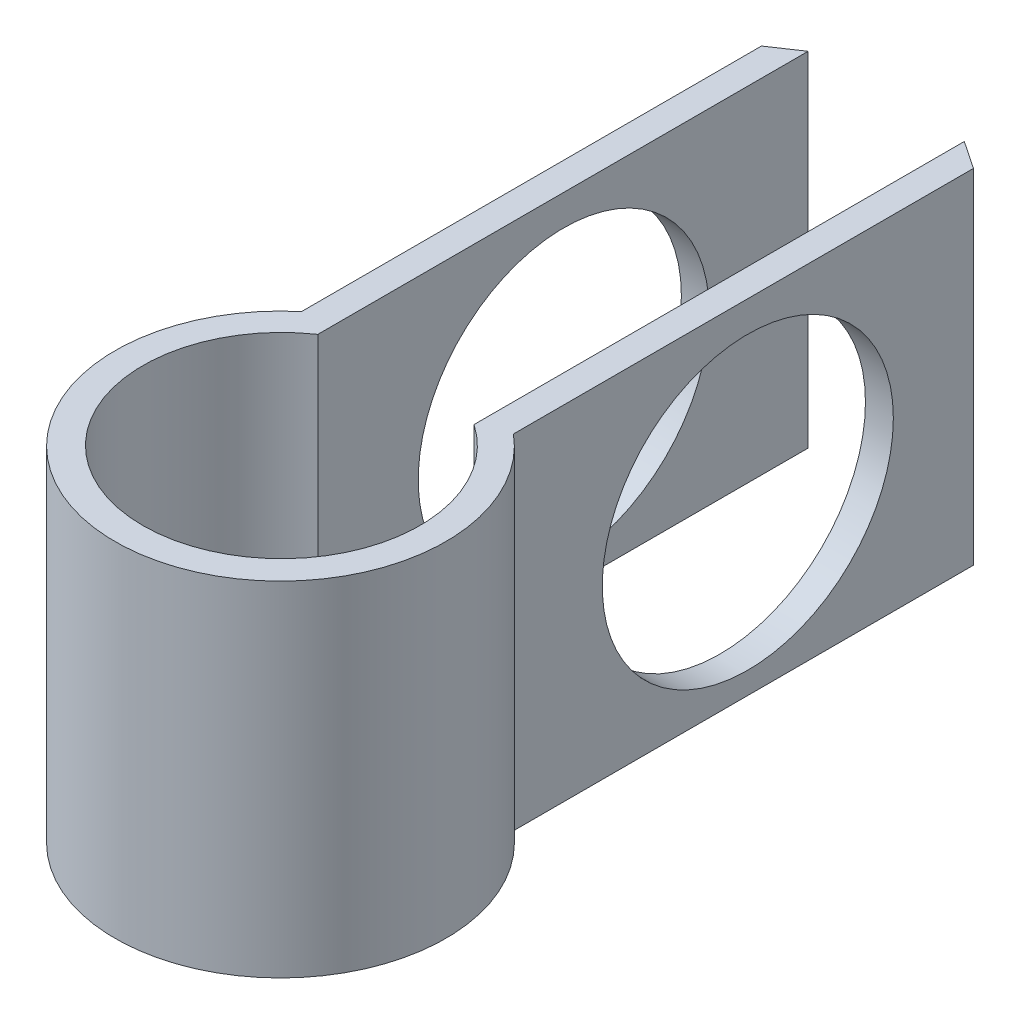
ISO-10303-21;
HEADER;
FILE_DESCRIPTION(('STEP AP214'),'2;1');
FILE_NAME('part.step','',(''),(''),'','','');
FILE_SCHEMA(('AUTOMOTIVE_DESIGN { 1 0 10303 214 1 1 1 1 }'));
ENDSEC;
DATA;
#1=APPLICATION_CONTEXT('core data for automotive mechanical design processes');
#2=APPLICATION_PROTOCOL_DEFINITION('international standard','automotive_design',2000,#1);
#3=PRODUCT_CONTEXT('',#1,'mechanical');
#4=PRODUCT('Part','Part','',(#3));
#5=PRODUCT_RELATED_PRODUCT_CATEGORY('part','',(#4));
#6=PRODUCT_DEFINITION_FORMATION('','',#4);
#7=PRODUCT_DEFINITION_CONTEXT('part definition',#1,'design');
#8=PRODUCT_DEFINITION('design','',#6,#7);
#9=PRODUCT_DEFINITION_SHAPE('','',#8);
#10=(LENGTH_UNIT() NAMED_UNIT(*) SI_UNIT(.MILLI.,.METRE.));
#11=(NAMED_UNIT(*) PLANE_ANGLE_UNIT() SI_UNIT($,.RADIAN.));
#12=(NAMED_UNIT(*) SI_UNIT($,.STERADIAN.) SOLID_ANGLE_UNIT());
#13=UNCERTAINTY_MEASURE_WITH_UNIT(LENGTH_MEASURE(1.E-05),#10,'distance_accuracy_value','');
#14=(GEOMETRIC_REPRESENTATION_CONTEXT(3) GLOBAL_UNCERTAINTY_ASSIGNED_CONTEXT((#13)) GLOBAL_UNIT_ASSIGNED_CONTEXT((#10,
#11,#12)) REPRESENTATION_CONTEXT('',''));
#15=CARTESIAN_POINT('',(0.,0.,0.));
#16=DIRECTION('',(0.,0.,1.));
#17=DIRECTION('',(1.,0.,0.));
#18=AXIS2_PLACEMENT_3D('',#15,#16,#17);
#19=CARTESIAN_POINT('',(136.250172,-31.57982,-107.259882));
#20=DIRECTION('',(0.557262321582365,0.,-0.830336501031138));
#21=DIRECTION('',(-0.830336501031138,0.,-0.557262321582365));
#22=AXIS2_PLACEMENT_3D('',#19,#20,#21);
#23=PLANE('',#22);
#24=DIRECTION('',(-0.830336501031138,0.,-0.557262321582365));
#25=VECTOR('',#24,1.);
#26=CARTESIAN_POINT('',(136.250172,0.,-107.259882));
#27=LINE('',#26,#25);
#28=CARTESIAN_POINT('',(136.250172,0.,-107.259882));
#29=VERTEX_POINT('',#28);
#30=CARTESIAN_POINT('',(133.688328,0.,-108.979208));
#31=VERTEX_POINT('',#30);
#32=EDGE_CURVE('E131',#29,#31,#27,.T.);
#33=ORIENTED_EDGE('',*,*,#32,.F.);
#34=DIRECTION('',(0.,1.,0.));
#35=VECTOR('',#34,1.);
#36=CARTESIAN_POINT('',(136.250172,-31.57982,-107.259882));
#37=LINE('',#36,#35);
#38=CARTESIAN_POINT('',(136.250172,-31.57982,-107.259882));
#39=VERTEX_POINT('',#38);
#40=EDGE_CURVE('E11',#39,#29,#37,.T.);
#41=ORIENTED_EDGE('',*,*,#40,.F.);
#42=DIRECTION('',(-0.830336501031138,0.,-0.557262321582365));
#43=VECTOR('',#42,1.);
#44=CARTESIAN_POINT('',(136.250172,-31.57982,-107.259882));
#45=LINE('',#44,#43);
#46=CARTESIAN_POINT('',(133.688328,-31.57982,-108.979208));
#47=VERTEX_POINT('',#46);
#48=EDGE_CURVE('E152',#39,#47,#45,.T.);
#49=ORIENTED_EDGE('',*,*,#48,.T.);
#50=DIRECTION('',(0.,1.,0.));
#51=VECTOR('',#50,1.);
#52=CARTESIAN_POINT('',(133.688328,-31.57982,-108.979208));
#53=LINE('',#52,#51);
#54=EDGE_CURVE('E89',#47,#31,#53,.T.);
#55=ORIENTED_EDGE('',*,*,#54,.T.);
#56=EDGE_LOOP('',(#33,#41,#49,#55));
#57=FACE_BOUND('',#56,.T.);
#58=ADVANCED_FACE('F33',(#57),#23,.T.);
#59=CARTESIAN_POINT('',(136.250172,-31.57982,-107.259882));
#60=DIRECTION('',(1.,0.,0.));
#61=DIRECTION('',(0.,0.,-1.));
#62=AXIS2_PLACEMENT_3D('',#59,#60,#61);
#63=PLANE('',#62);
#64=CARTESIAN_POINT('',(136.250172,-16.195802,-86.524338));
#65=DIRECTION('',(1.,0.,0.));
#66=DIRECTION('',(0.,0.,-1.));
#67=AXIS2_PLACEMENT_3D('',#64,#65,#66);
#68=CIRCLE('',#67,13.3728018566386);
#69=CARTESIAN_POINT('',(136.250172,-16.195802,-99.8971398566386));
#70=VERTEX_POINT('',#69);
#71=EDGE_CURVE('E201',#70,#70,#68,.T.);
#72=ORIENTED_EDGE('',*,*,#71,.F.);
#73=EDGE_LOOP('',(#72));
#74=FACE_BOUND('',#73,.T.);
#75=DIRECTION('',(0.,0.,-1.));
#76=VECTOR('',#75,1.);
#77=CARTESIAN_POINT('',(136.250172,0.,-107.259882));
#78=LINE('',#77,#76);
#79=CARTESIAN_POINT('',(136.250172,0.,-64.988694));
#80=VERTEX_POINT('',#79);
#81=EDGE_CURVE('E150',#80,#29,#78,.T.);
#82=ORIENTED_EDGE('',*,*,#81,.F.);
#83=DIRECTION('',(0.,1.,0.));
#84=VECTOR('',#83,1.);
#85=CARTESIAN_POINT('',(136.250172,-31.57982,-64.988694));
#86=LINE('',#85,#84);
#87=CARTESIAN_POINT('',(136.250172,-31.57982,-64.988694));
#88=VERTEX_POINT('',#87);
#89=EDGE_CURVE('E42',#88,#80,#86,.T.);
#90=ORIENTED_EDGE('',*,*,#89,.F.);
#91=DIRECTION('',(0.,0.,-1.));
#92=VECTOR('',#91,1.);
#93=CARTESIAN_POINT('',(136.250172,-31.57982,-107.259882));
#94=LINE('',#93,#92);
#95=EDGE_CURVE('E121',#88,#39,#94,.T.);
#96=ORIENTED_EDGE('',*,*,#95,.T.);
#97=ORIENTED_EDGE('',*,*,#40,.T.);
#98=EDGE_LOOP('',(#82,#90,#96,#97));
#99=FACE_BOUND('',#98,.T.);
#100=ADVANCED_FACE('F165',(#74,#99),#63,.T.);
#101=CARTESIAN_POINT('',(126.511558,-31.57982,-53.3185563632771));
#102=DIRECTION('',(0.,1.,0.));
#103=DIRECTION('',(0.,0.,1.));
#104=AXIS2_PLACEMENT_3D('',#101,#102,#103);
#105=CYLINDRICAL_SURFACE('',#104,15.1997603632772);
#106=CARTESIAN_POINT('',(126.511558,0.,-53.3185563632771));
#107=DIRECTION('',(0.,1.,0.));
#108=DIRECTION('',(0.,0.,1.));
#109=AXIS2_PLACEMENT_3D('',#106,#107,#108);
#110=CIRCLE('',#109,15.1997603632772);
#111=CARTESIAN_POINT('',(116.772944,0.,-64.988694));
#112=VERTEX_POINT('',#111);
#113=EDGE_CURVE('E108',#112,#80,#110,.T.);
#114=ORIENTED_EDGE('',*,*,#113,.F.);
#115=DIRECTION('',(0.,1.,0.));
#116=VECTOR('',#115,1.);
#117=CARTESIAN_POINT('',(116.772944,-31.57982,-64.988694));
#118=LINE('',#117,#116);
#119=CARTESIAN_POINT('',(116.772944,-31.57982,-64.988694));
#120=VERTEX_POINT('',#119);
#121=EDGE_CURVE('E103',#120,#112,#118,.T.);
#122=ORIENTED_EDGE('',*,*,#121,.F.);
#123=CARTESIAN_POINT('',(126.511558,-31.57982,-53.3185563632771));
#124=DIRECTION('',(0.,1.,0.));
#125=DIRECTION('',(0.,0.,1.));
#126=AXIS2_PLACEMENT_3D('',#123,#124,#125);
#127=CIRCLE('',#126,15.1997603632772);
#128=EDGE_CURVE('E106',#120,#88,#127,.T.);
#129=ORIENTED_EDGE('',*,*,#128,.T.);
#130=ORIENTED_EDGE('',*,*,#89,.T.);
#131=EDGE_LOOP('',(#114,#122,#129,#130));
#132=FACE_BOUND('',#131,.T.);
#133=ADVANCED_FACE('F105',(#132),#105,.T.);
#134=CARTESIAN_POINT('',(116.772944,-31.57982,-107.259882));
#135=DIRECTION('',(-1.,0.,0.));
#136=DIRECTION('',(0.,0.,1.));
#137=AXIS2_PLACEMENT_3D('',#134,#135,#136);
#138=PLANE('',#137);
#139=CARTESIAN_POINT('',(116.772944,-16.195802,-86.524338));
#140=DIRECTION('',(-1.,0.,0.));
#141=DIRECTION('',(0.,0.,1.));
#142=AXIS2_PLACEMENT_3D('',#139,#140,#141);
#143=CIRCLE('',#142,13.3728018566386);
#144=CARTESIAN_POINT('',(116.772944,-16.195802,-99.8971398566386));
#145=VERTEX_POINT('',#144);
#146=EDGE_CURVE('E135',#145,#145,#143,.T.);
#147=ORIENTED_EDGE('',*,*,#146,.F.);
#148=EDGE_LOOP('',(#147));
#149=FACE_BOUND('',#148,.T.);
#150=DIRECTION('',(0.,0.,1.));
#151=VECTOR('',#150,1.);
#152=CARTESIAN_POINT('',(116.772944,0.,-107.259882));
#153=LINE('',#152,#151);
#154=CARTESIAN_POINT('',(116.772944,0.,-107.259882));
#155=VERTEX_POINT('',#154);
#156=EDGE_CURVE('E147',#155,#112,#153,.T.);
#157=ORIENTED_EDGE('',*,*,#156,.F.);
#158=DIRECTION('',(0.,1.,0.));
#159=VECTOR('',#158,1.);
#160=CARTESIAN_POINT('',(116.772944,-31.57982,-107.259882));
#161=LINE('',#160,#159);
#162=CARTESIAN_POINT('',(116.772944,-31.57982,-107.259882));
#163=VERTEX_POINT('',#162);
#164=EDGE_CURVE('E113',#163,#155,#161,.T.);
#165=ORIENTED_EDGE('',*,*,#164,.F.);
#166=DIRECTION('',(0.,0.,1.));
#167=VECTOR('',#166,1.);
#168=CARTESIAN_POINT('',(116.772944,-31.57982,-107.259882));
#169=LINE('',#168,#167);
#170=EDGE_CURVE('E119',#163,#120,#169,.T.);
#171=ORIENTED_EDGE('',*,*,#170,.T.);
#172=ORIENTED_EDGE('',*,*,#121,.T.);
#173=EDGE_LOOP('',(#157,#165,#171,#172));
#174=FACE_BOUND('',#173,.T.);
#175=ADVANCED_FACE('F123',(#149,#174),#138,.T.);
#176=CARTESIAN_POINT('',(119.334788,-31.57982,-108.979208));
#177=DIRECTION('',(-0.557262321582367,0.,-0.830336501031136));
#178=DIRECTION('',(-0.830336501031136,0.,0.557262321582367));
#179=AXIS2_PLACEMENT_3D('',#176,#177,#178);
#180=PLANE('',#179);
#181=DIRECTION('',(-0.830336501031136,0.,0.557262321582367));
#182=VECTOR('',#181,1.);
#183=CARTESIAN_POINT('',(119.334788,0.,-108.979208));
#184=LINE('',#183,#182);
#185=CARTESIAN_POINT('',(119.334788,0.,-108.979208));
#186=VERTEX_POINT('',#185);
#187=EDGE_CURVE('E144',#186,#155,#184,.T.);
#188=ORIENTED_EDGE('',*,*,#187,.F.);
#189=DIRECTION('',(0.,1.,0.));
#190=VECTOR('',#189,1.);
#191=CARTESIAN_POINT('',(119.334788,-31.57982,-108.979208));
#192=LINE('',#191,#190);
#193=CARTESIAN_POINT('',(119.334788,-31.57982,-108.979208));
#194=VERTEX_POINT('',#193);
#195=EDGE_CURVE('E156',#194,#186,#192,.T.);
#196=ORIENTED_EDGE('',*,*,#195,.F.);
#197=DIRECTION('',(-0.830336501031136,0.,0.557262321582367));
#198=VECTOR('',#197,1.);
#199=CARTESIAN_POINT('',(119.334788,-31.57982,-108.979208));
#200=LINE('',#199,#198);
#201=EDGE_CURVE('E124',#194,#163,#200,.T.);
#202=ORIENTED_EDGE('',*,*,#201,.T.);
#203=ORIENTED_EDGE('',*,*,#164,.T.);
#204=EDGE_LOOP('',(#188,#196,#202,#203));
#205=FACE_BOUND('',#204,.T.);
#206=ADVANCED_FACE('F180',(#205),#180,.T.);
#207=CARTESIAN_POINT('',(119.334788,-31.57982,-108.979208));
#208=DIRECTION('',(1.,0.,0.));
#209=DIRECTION('',(0.,0.,-1.));
#210=AXIS2_PLACEMENT_3D('',#207,#208,#209);
#211=PLANE('',#210);
#212=CARTESIAN_POINT('',(119.334788,-16.195802,-86.524338));
#213=DIRECTION('',(1.,0.,0.));
#214=DIRECTION('',(0.,0.,-1.));
#215=AXIS2_PLACEMENT_3D('',#212,#213,#214);
#216=CIRCLE('',#215,13.3728018566386);
#217=CARTESIAN_POINT('',(119.334788,-16.195802,-99.8971398566386));
#218=VERTEX_POINT('',#217);
#219=EDGE_CURVE('E200',#218,#218,#216,.T.);
#220=ORIENTED_EDGE('',*,*,#219,.F.);
#221=EDGE_LOOP('',(#220));
#222=FACE_BOUND('',#221,.T.);
#223=DIRECTION('',(0.,0.,-1.));
#224=VECTOR('',#223,1.);
#225=CARTESIAN_POINT('',(119.334788,0.,-108.979208));
#226=LINE('',#225,#224);
#227=CARTESIAN_POINT('',(119.334788,0.,-63.925704));
#228=VERTEX_POINT('',#227);
#229=EDGE_CURVE('E141',#228,#186,#226,.T.);
#230=ORIENTED_EDGE('',*,*,#229,.F.);
#231=DIRECTION('',(0.,1.,0.));
#232=VECTOR('',#231,1.);
#233=CARTESIAN_POINT('',(119.334788,-31.57982,-63.925704));
#234=LINE('',#233,#232);
#235=CARTESIAN_POINT('',(119.334788,-31.57982,-63.925704));
#236=VERTEX_POINT('',#235);
#237=EDGE_CURVE('E158',#236,#228,#234,.T.);
#238=ORIENTED_EDGE('',*,*,#237,.F.);
#239=DIRECTION('',(0.,0.,-1.));
#240=VECTOR('',#239,1.);
#241=CARTESIAN_POINT('',(119.334788,-31.57982,-108.979208));
#242=LINE('',#241,#240);
#243=EDGE_CURVE('E126',#236,#194,#242,.T.);
#244=ORIENTED_EDGE('',*,*,#243,.T.);
#245=ORIENTED_EDGE('',*,*,#195,.T.);
#246=EDGE_LOOP('',(#230,#238,#244,#245));
#247=FACE_BOUND('',#246,.T.);
#248=ADVANCED_FACE('F184',(#222,#247),#211,.T.);
#249=CARTESIAN_POINT('',(126.511558,-31.57982,-53.4056387823712));
#250=DIRECTION('',(0.,1.,0.));
#251=DIRECTION('',(0.,0.,1.));
#252=AXIS2_PLACEMENT_3D('',#249,#250,#251);
#253=CYLINDRICAL_SURFACE('',#252,12.7349047823713);
#254=CARTESIAN_POINT('',(126.511558,0.,-53.4056387823712));
#255=DIRECTION('',(0.,-1.,0.));
#256=DIRECTION('',(0.,0.,1.));
#257=AXIS2_PLACEMENT_3D('',#254,#255,#256);
#258=CIRCLE('',#257,12.7349047823713);
#259=CARTESIAN_POINT('',(133.688328,0.,-63.925704));
#260=VERTEX_POINT('',#259);
#261=EDGE_CURVE('E138',#260,#228,#258,.T.);
#262=ORIENTED_EDGE('',*,*,#261,.F.);
#263=DIRECTION('',(0.,1.,0.));
#264=VECTOR('',#263,1.);
#265=CARTESIAN_POINT('',(133.688328,-31.57982,-63.925704));
#266=LINE('',#265,#264);
#267=CARTESIAN_POINT('',(133.688328,-31.57982,-63.925704));
#268=VERTEX_POINT('',#267);
#269=EDGE_CURVE('E160',#268,#260,#266,.T.);
#270=ORIENTED_EDGE('',*,*,#269,.F.);
#271=CARTESIAN_POINT('',(126.511558,-31.57982,-53.4056387823712));
#272=DIRECTION('',(0.,-1.,0.));
#273=DIRECTION('',(0.,0.,1.));
#274=AXIS2_PLACEMENT_3D('',#271,#272,#273);
#275=CIRCLE('',#274,12.7349047823713);
#276=EDGE_CURVE('E213',#268,#236,#275,.T.);
#277=ORIENTED_EDGE('',*,*,#276,.T.);
#278=ORIENTED_EDGE('',*,*,#237,.T.);
#279=EDGE_LOOP('',(#262,#270,#277,#278));
#280=FACE_BOUND('',#279,.T.);
#281=ADVANCED_FACE('F188',(#280),#253,.F.);
#282=CARTESIAN_POINT('',(133.688328,-31.57982,-108.979208));
#283=DIRECTION('',(-1.,0.,0.));
#284=DIRECTION('',(0.,0.,1.));
#285=AXIS2_PLACEMENT_3D('',#282,#283,#284);
#286=PLANE('',#285);
#287=CARTESIAN_POINT('',(133.688328,-16.195802,-86.524338));
#288=DIRECTION('',(-1.,0.,0.));
#289=DIRECTION('',(0.,0.,1.));
#290=AXIS2_PLACEMENT_3D('',#287,#288,#289);
#291=CIRCLE('',#290,13.3728018566386);
#292=CARTESIAN_POINT('',(133.688328,-16.195802,-99.8971398566386));
#293=VERTEX_POINT('',#292);
#294=EDGE_CURVE('E36',#293,#293,#291,.T.);
#295=ORIENTED_EDGE('',*,*,#294,.F.);
#296=EDGE_LOOP('',(#295));
#297=FACE_BOUND('',#296,.T.);
#298=DIRECTION('',(0.,0.,1.));
#299=VECTOR('',#298,1.);
#300=CARTESIAN_POINT('',(133.688328,0.,-108.979208));
#301=LINE('',#300,#299);
#302=EDGE_CURVE('E134',#31,#260,#301,.T.);
#303=ORIENTED_EDGE('',*,*,#302,.F.);
#304=ORIENTED_EDGE('',*,*,#54,.F.);
#305=DIRECTION('',(0.,0.,1.));
#306=VECTOR('',#305,1.);
#307=CARTESIAN_POINT('',(133.688328,-31.57982,-108.979208));
#308=LINE('',#307,#306);
#309=EDGE_CURVE('E211',#47,#268,#308,.T.);
#310=ORIENTED_EDGE('',*,*,#309,.T.);
#311=ORIENTED_EDGE('',*,*,#269,.T.);
#312=EDGE_LOOP('',(#303,#304,#310,#311));
#313=FACE_BOUND('',#312,.T.);
#314=ADVANCED_FACE('F161',(#297,#313),#286,.T.);
#315=CARTESIAN_POINT('',(126.511558,-31.57982,-53.4056387823712));
#316=DIRECTION('',(0.,1.,0.));
#317=DIRECTION('',(0.,0.,1.));
#318=AXIS2_PLACEMENT_3D('',#315,#316,#317);
#319=PLANE('',#318);
#320=ORIENTED_EDGE('',*,*,#48,.F.);
#321=ORIENTED_EDGE('',*,*,#95,.F.);
#322=ORIENTED_EDGE('',*,*,#128,.F.);
#323=ORIENTED_EDGE('',*,*,#170,.F.);
#324=ORIENTED_EDGE('',*,*,#201,.F.);
#325=ORIENTED_EDGE('',*,*,#243,.F.);
#326=ORIENTED_EDGE('',*,*,#276,.F.);
#327=ORIENTED_EDGE('',*,*,#309,.F.);
#328=EDGE_LOOP('',(#320,#321,#322,#323,#324,#325,#326,#327));
#329=FACE_BOUND('',#328,.T.);
#330=ADVANCED_FACE('F117',(#329),#319,.F.);
#331=CARTESIAN_POINT('',(126.511558,0.,-53.4056387823712));
#332=DIRECTION('',(0.,1.,0.));
#333=DIRECTION('',(0.,0.,1.));
#334=AXIS2_PLACEMENT_3D('',#331,#332,#333);
#335=PLANE('',#334);
#336=ORIENTED_EDGE('',*,*,#32,.T.);
#337=ORIENTED_EDGE('',*,*,#302,.T.);
#338=ORIENTED_EDGE('',*,*,#261,.T.);
#339=ORIENTED_EDGE('',*,*,#229,.T.);
#340=ORIENTED_EDGE('',*,*,#187,.T.);
#341=ORIENTED_EDGE('',*,*,#156,.T.);
#342=ORIENTED_EDGE('',*,*,#113,.T.);
#343=ORIENTED_EDGE('',*,*,#81,.T.);
#344=EDGE_LOOP('',(#336,#337,#338,#339,#340,#341,#342,#343));
#345=FACE_BOUND('',#344,.T.);
#346=ADVANCED_FACE('F164',(#345),#335,.T.);
#347=CARTESIAN_POINT('',(111.311797636723,-16.195802,-86.524338));
#348=DIRECTION('',(1.,0.,0.));
#349=DIRECTION('',(0.,0.,-1.));
#350=AXIS2_PLACEMENT_3D('',#347,#348,#349);
#351=CYLINDRICAL_SURFACE('',#350,13.3728018566386);
#352=CARTESIAN_POINT('',(133.688328,-16.195802,-99.8971398566386));
#353=CARTESIAN_POINT('',(133.715013875,-16.195802,-99.8971398566386));
#354=CARTESIAN_POINT('',(133.74169975,-16.195802,-99.8971398566386));
#355=CARTESIAN_POINT('',(133.7950715,-16.195802,-99.8971398566386));
#356=CARTESIAN_POINT('',(133.821757375,-16.195802,-99.8971398566386));
#357=CARTESIAN_POINT('',(133.875129125,-16.195802,-99.8971398566386));
#358=CARTESIAN_POINT('',(133.901815,-16.195802,-99.8971398566386));
#359=CARTESIAN_POINT('',(133.95518675,-16.195802,-99.8971398566386));
#360=CARTESIAN_POINT('',(133.981872625,-16.195802,-99.8971398566386));
#361=CARTESIAN_POINT('',(134.035244375,-16.195802,-99.8971398566386));
#362=CARTESIAN_POINT('',(134.06193025,-16.195802,-99.8971398566386));
#363=CARTESIAN_POINT('',(134.115302,-16.195802,-99.8971398566386));
#364=CARTESIAN_POINT('',(134.141987875,-16.195802,-99.8971398566386));
#365=CARTESIAN_POINT('',(134.195359625,-16.195802,-99.8971398566386));
#366=CARTESIAN_POINT('',(134.2220455,-16.195802,-99.8971398566386));
#367=CARTESIAN_POINT('',(134.27541725,-16.195802,-99.8971398566386));
#368=CARTESIAN_POINT('',(134.302103125,-16.195802,-99.8971398566386));
#369=CARTESIAN_POINT('',(134.355474875,-16.195802,-99.8971398566386));
#370=CARTESIAN_POINT('',(134.38216075,-16.195802,-99.8971398566386));
#371=CARTESIAN_POINT('',(134.4355325,-16.195802,-99.8971398566386));
#372=CARTESIAN_POINT('',(134.462218375,-16.195802,-99.8971398566386));
#373=CARTESIAN_POINT('',(134.515590125,-16.195802,-99.8971398566386));
#374=CARTESIAN_POINT('',(134.542276,-16.195802,-99.8971398566386));
#375=CARTESIAN_POINT('',(134.59564775,-16.195802,-99.8971398566386));
#376=CARTESIAN_POINT('',(134.622333625,-16.195802,-99.8971398566386));
#377=CARTESIAN_POINT('',(134.675705375,-16.195802,-99.8971398566386));
#378=CARTESIAN_POINT('',(134.70239125,-16.195802,-99.8971398566386));
#379=CARTESIAN_POINT('',(134.755763,-16.195802,-99.8971398566386));
#380=CARTESIAN_POINT('',(134.782448875,-16.195802,-99.8971398566386));
#381=CARTESIAN_POINT('',(134.835820625,-16.195802,-99.8971398566386));
#382=CARTESIAN_POINT('',(134.8625065,-16.195802,-99.8971398566386));
#383=CARTESIAN_POINT('',(134.91587825,-16.195802,-99.8971398566386));
#384=CARTESIAN_POINT('',(134.942564125,-16.195802,-99.8971398566386));
#385=CARTESIAN_POINT('',(134.995935875,-16.195802,-99.8971398566386));
#386=CARTESIAN_POINT('',(135.02262175,-16.195802,-99.8971398566386));
#387=CARTESIAN_POINT('',(135.0759935,-16.195802,-99.8971398566386));
#388=CARTESIAN_POINT('',(135.102679375,-16.195802,-99.8971398566386));
#389=CARTESIAN_POINT('',(135.156051125,-16.195802,-99.8971398566386));
#390=CARTESIAN_POINT('',(135.182737,-16.195802,-99.8971398566386));
#391=CARTESIAN_POINT('',(135.23610875,-16.195802,-99.8971398566386));
#392=CARTESIAN_POINT('',(135.262794625,-16.195802,-99.8971398566386));
#393=CARTESIAN_POINT('',(135.316166375,-16.195802,-99.8971398566386));
#394=CARTESIAN_POINT('',(135.34285225,-16.195802,-99.8971398566386));
#395=CARTESIAN_POINT('',(135.396224,-16.195802,-99.8971398566386));
#396=CARTESIAN_POINT('',(135.422909875,-16.195802,-99.8971398566386));
#397=CARTESIAN_POINT('',(135.476281625,-16.195802,-99.8971398566386));
#398=CARTESIAN_POINT('',(135.5029675,-16.195802,-99.8971398566386));
#399=CARTESIAN_POINT('',(135.55633925,-16.195802,-99.8971398566386));
#400=CARTESIAN_POINT('',(135.583025125,-16.195802,-99.8971398566386));
#401=CARTESIAN_POINT('',(135.636396875,-16.195802,-99.8971398566386));
#402=CARTESIAN_POINT('',(135.66308275,-16.195802,-99.8971398566386));
#403=CARTESIAN_POINT('',(135.7164545,-16.195802,-99.8971398566386));
#404=CARTESIAN_POINT('',(135.743140375,-16.195802,-99.8971398566386));
#405=CARTESIAN_POINT('',(135.796512125,-16.195802,-99.8971398566386));
#406=CARTESIAN_POINT('',(135.823198,-16.195802,-99.8971398566386));
#407=CARTESIAN_POINT('',(135.87656975,-16.195802,-99.8971398566386));
#408=CARTESIAN_POINT('',(135.903255625,-16.195802,-99.8971398566386));
#409=CARTESIAN_POINT('',(135.956627375,-16.195802,-99.8971398566386));
#410=CARTESIAN_POINT('',(135.98331325,-16.195802,-99.8971398566386));
#411=CARTESIAN_POINT('',(136.036685,-16.195802,-99.8971398566386));
#412=CARTESIAN_POINT('',(136.063370875,-16.195802,-99.8971398566386));
#413=CARTESIAN_POINT('',(136.116742625,-16.195802,-99.8971398566386));
#414=CARTESIAN_POINT('',(136.1434285,-16.195802,-99.8971398566386));
#415=CARTESIAN_POINT('',(136.19680025,-16.195802,-99.8971398566386));
#416=CARTESIAN_POINT('',(136.223486125,-16.195802,-99.8971398566386));
#417=CARTESIAN_POINT('',(136.250172,-16.195802,-99.8971398566386));
#418=B_SPLINE_CURVE_WITH_KNOTS('',3,(#352,#353,#354,#355,#356,#357,#358,#359,#360,#361,#362,
#363,#364,#365,#366,#367,#368,#369,#370,#371,#372,#373,#374,#375,#376,#377,#378,#379,#380,#381,
#382,#383,#384,#385,#386,#387,#388,#389,#390,#391,#392,#393,#394,#395,#396,#397,#398,#399,#400,
#401,#402,#403,#404,#405,#406,#407,#408,#409,#410,#411,#412,#413,#414,#415,#416,#417),
.UNSPECIFIED.,.F.,.F.,(4,2,2,2,2,2,2,2,2,2,2,2,2,2,2,2,2,2,2,2,2,2,2,2,2,2,2,2,2,2,2,2,4),(0.,
0.0800576250000185,0.160115250000009,0.240172875,0.320230500000018,0.400288125000009,0.48034575,
0.560403375000018,0.640461000000009,0.720518625,0.80057624999999,0.880633875000009,
0.960691499999999,1.04074912499999,1.12080675000001,1.200864375,1.28092199999999,
1.36097962500001,1.44103725,1.52109487499999,1.60115250000001,1.681210125,1.76126774999999,
1.84132537500001,1.921383,2.00144062499999,2.08149825000001,2.161555875,2.24161349999999,
2.32167112499998,2.40172875,2.48178637499999,2.56184399999998),.UNSPECIFIED.);
#419=EDGE_CURVE('BSEAM226',#293,#70,#418,.T.);
#420=ORIENTED_EDGE('',*,*,#294,.T.);
#421=ORIENTED_EDGE('',*,*,#71,.T.);
#422=ORIENTED_EDGE('',*,*,#419,.T.);
#423=ORIENTED_EDGE('',*,*,#419,.F.);
#424=EDGE_LOOP('',(#420,#422,#421,#423));
#425=FACE_BOUND('',#424,.T.);
#426=ADVANCED_FACE('F226',(#425),#351,.F.);
#427=CARTESIAN_POINT('',(116.772944,-16.195802,-99.8971398566386));
#428=CARTESIAN_POINT('',(116.799629875,-16.195802,-99.8971398566386));
#429=CARTESIAN_POINT('',(116.82631575,-16.195802,-99.8971398566386));
#430=CARTESIAN_POINT('',(116.8796875,-16.195802,-99.8971398566386));
#431=CARTESIAN_POINT('',(116.906373375,-16.195802,-99.8971398566386));
#432=CARTESIAN_POINT('',(116.959745125,-16.195802,-99.8971398566386));
#433=CARTESIAN_POINT('',(116.986431,-16.195802,-99.8971398566386));
#434=CARTESIAN_POINT('',(117.03980275,-16.195802,-99.8971398566386));
#435=CARTESIAN_POINT('',(117.066488625,-16.195802,-99.8971398566386));
#436=CARTESIAN_POINT('',(117.119860375,-16.195802,-99.8971398566386));
#437=CARTESIAN_POINT('',(117.14654625,-16.195802,-99.8971398566386));
#438=CARTESIAN_POINT('',(117.199918,-16.195802,-99.8971398566386));
#439=CARTESIAN_POINT('',(117.226603875,-16.195802,-99.8971398566386));
#440=CARTESIAN_POINT('',(117.279975625,-16.195802,-99.8971398566386));
#441=CARTESIAN_POINT('',(117.3066615,-16.195802,-99.8971398566386));
#442=CARTESIAN_POINT('',(117.36003325,-16.195802,-99.8971398566386));
#443=CARTESIAN_POINT('',(117.386719125,-16.195802,-99.8971398566386));
#444=CARTESIAN_POINT('',(117.440090875,-16.195802,-99.8971398566386));
#445=CARTESIAN_POINT('',(117.46677675,-16.195802,-99.8971398566386));
#446=CARTESIAN_POINT('',(117.5201485,-16.195802,-99.8971398566386));
#447=CARTESIAN_POINT('',(117.546834375,-16.195802,-99.8971398566386));
#448=CARTESIAN_POINT('',(117.600206125,-16.195802,-99.8971398566386));
#449=CARTESIAN_POINT('',(117.626892,-16.195802,-99.8971398566386));
#450=CARTESIAN_POINT('',(117.68026375,-16.195802,-99.8971398566386));
#451=CARTESIAN_POINT('',(117.706949625,-16.195802,-99.8971398566386));
#452=CARTESIAN_POINT('',(117.760321375,-16.195802,-99.8971398566386));
#453=CARTESIAN_POINT('',(117.78700725,-16.195802,-99.8971398566386));
#454=CARTESIAN_POINT('',(117.840379,-16.195802,-99.8971398566386));
#455=CARTESIAN_POINT('',(117.867064875,-16.195802,-99.8971398566386));
#456=CARTESIAN_POINT('',(117.920436625,-16.195802,-99.8971398566386));
#457=CARTESIAN_POINT('',(117.9471225,-16.195802,-99.8971398566386));
#458=CARTESIAN_POINT('',(118.00049425,-16.195802,-99.8971398566386));
#459=CARTESIAN_POINT('',(118.027180125,-16.195802,-99.8971398566386));
#460=CARTESIAN_POINT('',(118.080551875,-16.195802,-99.8971398566386));
#461=CARTESIAN_POINT('',(118.10723775,-16.195802,-99.8971398566386));
#462=CARTESIAN_POINT('',(118.1606095,-16.195802,-99.8971398566386));
#463=CARTESIAN_POINT('',(118.187295375,-16.195802,-99.8971398566386));
#464=CARTESIAN_POINT('',(118.240667125,-16.195802,-99.8971398566386));
#465=CARTESIAN_POINT('',(118.267353,-16.195802,-99.8971398566386));
#466=CARTESIAN_POINT('',(118.32072475,-16.195802,-99.8971398566386));
#467=CARTESIAN_POINT('',(118.347410625,-16.195802,-99.8971398566386));
#468=CARTESIAN_POINT('',(118.400782375,-16.195802,-99.8971398566386));
#469=CARTESIAN_POINT('',(118.42746825,-16.195802,-99.8971398566386));
#470=CARTESIAN_POINT('',(118.48084,-16.195802,-99.8971398566386));
#471=CARTESIAN_POINT('',(118.507525875,-16.195802,-99.8971398566386));
#472=CARTESIAN_POINT('',(118.560897625,-16.195802,-99.8971398566386));
#473=CARTESIAN_POINT('',(118.5875835,-16.195802,-99.8971398566386));
#474=CARTESIAN_POINT('',(118.64095525,-16.195802,-99.8971398566386));
#475=CARTESIAN_POINT('',(118.667641125,-16.195802,-99.8971398566386));
#476=CARTESIAN_POINT('',(118.721012875,-16.195802,-99.8971398566386));
#477=CARTESIAN_POINT('',(118.74769875,-16.195802,-99.8971398566386));
#478=CARTESIAN_POINT('',(118.8010705,-16.195802,-99.8971398566386));
#479=CARTESIAN_POINT('',(118.827756375,-16.195802,-99.8971398566386));
#480=CARTESIAN_POINT('',(118.881128125,-16.195802,-99.8971398566386));
#481=CARTESIAN_POINT('',(118.907814,-16.195802,-99.8971398566386));
#482=CARTESIAN_POINT('',(118.96118575,-16.195802,-99.8971398566386));
#483=CARTESIAN_POINT('',(118.987871625,-16.195802,-99.8971398566386));
#484=CARTESIAN_POINT('',(119.041243375,-16.195802,-99.8971398566386));
#485=CARTESIAN_POINT('',(119.06792925,-16.195802,-99.8971398566386));
#486=CARTESIAN_POINT('',(119.121301,-16.195802,-99.8971398566386));
#487=CARTESIAN_POINT('',(119.147986875,-16.195802,-99.8971398566386));
#488=CARTESIAN_POINT('',(119.201358625,-16.195802,-99.8971398566386));
#489=CARTESIAN_POINT('',(119.2280445,-16.195802,-99.8971398566386));
#490=CARTESIAN_POINT('',(119.28141625,-16.195802,-99.8971398566386));
#491=CARTESIAN_POINT('',(119.308102125,-16.195802,-99.8971398566386));
#492=CARTESIAN_POINT('',(119.334788,-16.195802,-99.8971398566386));
#493=B_SPLINE_CURVE_WITH_KNOTS('',3,(#427,#428,#429,#430,#431,#432,#433,#434,#435,#436,#437,
#438,#439,#440,#441,#442,#443,#444,#445,#446,#447,#448,#449,#450,#451,#452,#453,#454,#455,#456,
#457,#458,#459,#460,#461,#462,#463,#464,#465,#466,#467,#468,#469,#470,#471,#472,#473,#474,#475,
#476,#477,#478,#479,#480,#481,#482,#483,#484,#485,#486,#487,#488,#489,#490,#491,#492),
.UNSPECIFIED.,.F.,.F.,(4,2,2,2,2,2,2,2,2,2,2,2,2,2,2,2,2,2,2,2,2,2,2,2,2,2,2,2,2,2,2,2,4),(0.,
0.0800576250000046,0.160115250000009,0.240172875,0.320230500000004,0.400288125000009,0.48034575,
0.560403375000004,0.640460999999995,0.720518625,0.800576250000004,0.880633874999995,
0.960691499999999,1.040749125,1.12080674999999,1.200864375,1.28092199999999,1.36097962499999,
1.44103725,1.52109487499999,1.60115249999999,1.681210125,1.76126774999999,1.84132537499999,
1.92138299999998,2.00144062499999,2.08149824999999,2.16155587499998,2.24161349999999,
2.32167112499999,2.40172874999998,2.48178637499999,2.56184399999998),.UNSPECIFIED.);
#494=EDGE_CURVE('BSEAM223',#145,#218,#493,.T.);
#495=ORIENTED_EDGE('',*,*,#146,.T.);
#496=ORIENTED_EDGE('',*,*,#219,.T.);
#497=ORIENTED_EDGE('',*,*,#494,.T.);
#498=ORIENTED_EDGE('',*,*,#494,.F.);
#499=EDGE_LOOP('',(#495,#497,#496,#498));
#500=FACE_BOUND('',#499,.T.);
#501=ADVANCED_FACE('F223',(#500),#351,.F.);
#502=CLOSED_SHELL('',(#58,#100,#133,#175,#206,#248,#281,#314,#330,#346,#426,#501));
#503=MANIFOLD_SOLID_BREP('B2',#502);
#504=ADVANCED_BREP_SHAPE_REPRESENTATION('',(#18,#503),#14);
#505=SHAPE_DEFINITION_REPRESENTATION(#9,#504);
ENDSEC;
END-ISO-10303-21;
